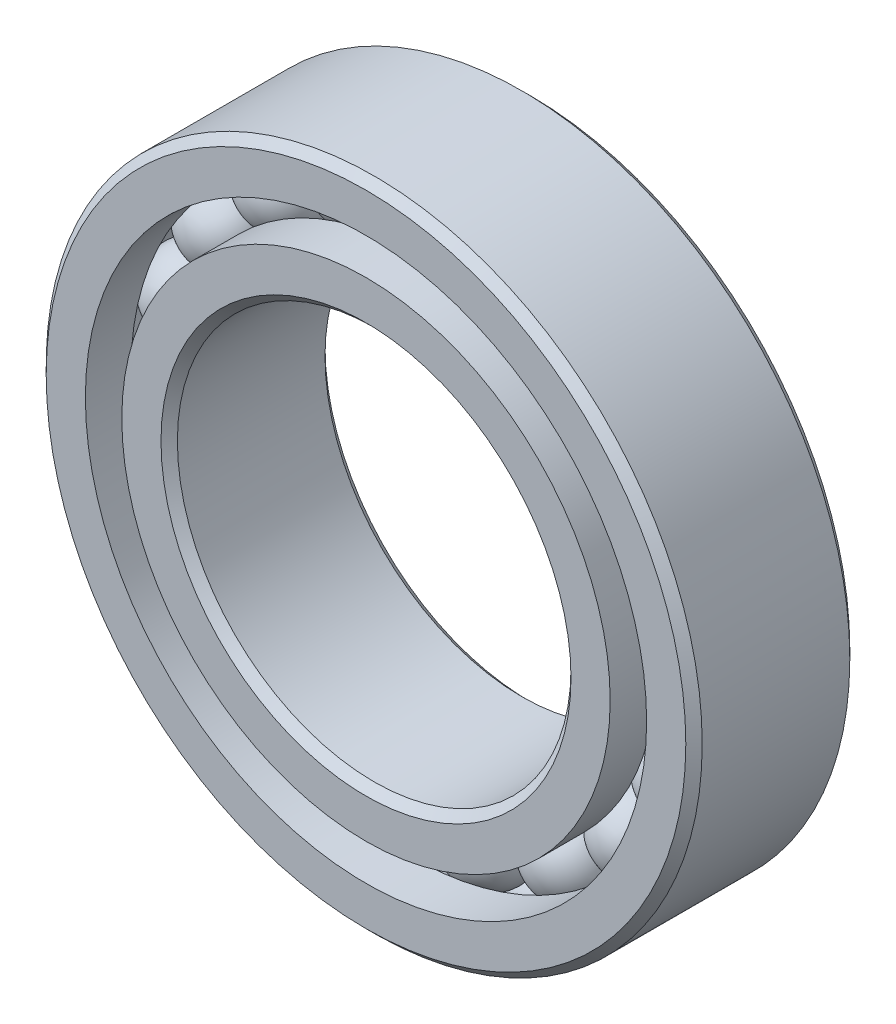
ISO-10303-21;
HEADER;
FILE_DESCRIPTION(('STEP AP214'),'2;1');
FILE_NAME('part.step','',(''),(''),'','','');
FILE_SCHEMA(('AUTOMOTIVE_DESIGN { 1 0 10303 214 1 1 1 1 }'));
ENDSEC;
DATA;
#1=APPLICATION_CONTEXT('core data for automotive mechanical design processes');
#2=APPLICATION_PROTOCOL_DEFINITION('international standard','automotive_design',2000,#1);
#3=PRODUCT_CONTEXT('',#1,'mechanical');
#4=PRODUCT('Part','Part','',(#3));
#5=PRODUCT_RELATED_PRODUCT_CATEGORY('part','',(#4));
#6=PRODUCT_DEFINITION_FORMATION('','',#4);
#7=PRODUCT_DEFINITION_CONTEXT('part definition',#1,'design');
#8=PRODUCT_DEFINITION('design','',#6,#7);
#9=PRODUCT_DEFINITION_SHAPE('','',#8);
#10=(LENGTH_UNIT() NAMED_UNIT(*) SI_UNIT(.MILLI.,.METRE.));
#11=(NAMED_UNIT(*) PLANE_ANGLE_UNIT() SI_UNIT($,.RADIAN.));
#12=(NAMED_UNIT(*) SI_UNIT($,.STERADIAN.) SOLID_ANGLE_UNIT());
#13=UNCERTAINTY_MEASURE_WITH_UNIT(LENGTH_MEASURE(1.E-05),#10,'distance_accuracy_value','');
#14=(GEOMETRIC_REPRESENTATION_CONTEXT(3) GLOBAL_UNCERTAINTY_ASSIGNED_CONTEXT((#13)) GLOBAL_UNIT_ASSIGNED_CONTEXT((#10,
#11,#12)) REPRESENTATION_CONTEXT('',''));
#15=CARTESIAN_POINT('',(0.,0.,0.));
#16=DIRECTION('',(0.,0.,1.));
#17=DIRECTION('',(1.,0.,0.));
#18=AXIS2_PLACEMENT_3D('',#15,#16,#17);
#19=CARTESIAN_POINT('',(-1.29879787681868,3.78326896680256,0.));
#20=DIRECTION('',(0.,0.,1.));
#21=DIRECTION('',(-0.324699469204671,0.945817241700639,0.));
#22=AXIS2_PLACEMENT_3D('',#19,#20,#21);
#23=SPHERICAL_SURFACE('',#22,0.621129993749942);
#24=CARTESIAN_POINT('',(-1.29879787681868,3.78326896680256,0.621129993749942));
#25=VERTEX_POINT('',#24);
#26=VERTEX_LOOP('',#25);
#27=FACE_BOUND('',#26,.T.);
#28=ADVANCED_FACE('F42',(#27),#23,.T.);
#29=CLOSED_SHELL('',(#28));
#30=MANIFOLD_SOLID_BREP('B2',#29);
#31=CARTESIAN_POINT('',(-2.45685085075863,3.1565620375856,0.));
#32=DIRECTION('',(0.,0.,1.));
#33=DIRECTION('',(-0.614212712689658,0.789140509396401,0.));
#34=AXIS2_PLACEMENT_3D('',#31,#32,#33);
#35=SPHERICAL_SURFACE('',#34,0.621129993749942);
#36=CARTESIAN_POINT('',(-2.45685085075863,3.1565620375856,0.621129993749942));
#37=VERTEX_POINT('',#36);
#38=VERTEX_LOOP('',#37);
#39=FACE_BOUND('',#38,.T.);
#40=ADVANCED_FACE('F61',(#39),#35,.T.);
#41=CLOSED_SHELL('',(#40));
#42=MANIFOLD_SOLID_BREP('B6',#41);
#43=CARTESIAN_POINT('',(-3.34866591305009,2.18779263248974,0.));
#44=DIRECTION('',(0.,0.,1.));
#45=DIRECTION('',(-0.837166478262522,0.546948158122436,0.));
#46=AXIS2_PLACEMENT_3D('',#43,#44,#45);
#47=SPHERICAL_SURFACE('',#46,0.621129993749942);
#48=CARTESIAN_POINT('',(-3.34866591305009,2.18779263248974,0.621129993749942));
#49=VERTEX_POINT('',#48);
#50=VERTEX_LOOP('',#49);
#51=FACE_BOUND('',#50,.T.);
#52=ADVANCED_FACE('F80',(#51),#47,.T.);
#53=CLOSED_SHELL('',(#52));
#54=MANIFOLD_SOLID_BREP('B38',#53);
#55=CARTESIAN_POINT('',(-3.87760106375731,0.981941948563236,0.));
#56=DIRECTION('',(0.,0.,1.));
#57=DIRECTION('',(-0.969400265939328,0.245485487140809,0.));
#58=AXIS2_PLACEMENT_3D('',#55,#56,#57);
#59=SPHERICAL_SURFACE('',#58,0.621129993749942);
#60=CARTESIAN_POINT('',(-3.87760106375731,0.981941948563236,0.621129993749942));
#61=VERTEX_POINT('',#60);
#62=VERTEX_LOOP('',#61);
#63=FACE_BOUND('',#62,.T.);
#64=ADVANCED_FACE('F98',(#63),#59,.T.);
#65=CLOSED_SHELL('',(#64));
#66=MANIFOLD_SOLID_BREP('B57',#65);
#67=CARTESIAN_POINT('',(-3.98633797202668,-0.330317381889292,0.));
#68=DIRECTION('',(0.,0.,1.));
#69=DIRECTION('',(-0.996584493006671,-0.082579345472323,0.));
#70=AXIS2_PLACEMENT_3D('',#67,#68,#69);
#71=SPHERICAL_SURFACE('',#70,0.621129993749942);
#72=CARTESIAN_POINT('',(-3.98633797202668,-0.330317381889292,0.621129993749942));
#73=VERTEX_POINT('',#72);
#74=VERTEX_LOOP('',#73);
#75=FACE_BOUND('',#74,.T.);
#76=ADVANCED_FACE('F133',(#75),#71,.T.);
#77=CLOSED_SHELL('',(#76));
#78=MANIFOLD_SOLID_BREP('B76',#77);
#79=CARTESIAN_POINT('',(-3.66309330662024,-1.60678169861184,0.));
#80=DIRECTION('',(0.,0.,1.));
#81=DIRECTION('',(-0.915773326655061,-0.401695424652961,0.));
#82=AXIS2_PLACEMENT_3D('',#79,#80,#81);
#83=SPHERICAL_SURFACE('',#82,0.621129993749942);
#84=CARTESIAN_POINT('',(-3.66309330662024,-1.60678169861184,0.621129993749942));
#85=VERTEX_POINT('',#84);
#86=VERTEX_LOOP('',#85);
#87=FACE_BOUND('',#86,.T.);
#88=ADVANCED_FACE('F168',(#87),#83,.T.);
#89=CLOSED_SHELL('',(#88));
#90=MANIFOLD_SOLID_BREP('B94',#89);
#91=CARTESIAN_POINT('',(-2.94289564269255,-2.70912628650294,0.));
#92=DIRECTION('',(0.,0.,1.));
#93=DIRECTION('',(-0.735723910673137,-0.677281571625735,0.));
#94=AXIS2_PLACEMENT_3D('',#91,#92,#93);
#95=SPHERICAL_SURFACE('',#94,0.621129993749942);
#96=CARTESIAN_POINT('',(-2.94289564269255,-2.70912628650294,0.621129993749942));
#97=VERTEX_POINT('',#96);
#98=VERTEX_LOOP('',#97);
#99=FACE_BOUND('',#98,.T.);
#100=ADVANCED_FACE('F203',(#99),#95,.T.);
#101=CLOSED_SHELL('',(#100));
#102=MANIFOLD_SOLID_BREP('B129',#101);
#103=CARTESIAN_POINT('',(-1.90378957214832,-3.51789500482594,0.));
#104=DIRECTION('',(0.,0.,1.));
#105=DIRECTION('',(-0.47594739303708,-0.879473751206486,0.));
#106=AXIS2_PLACEMENT_3D('',#103,#104,#105);
#107=SPHERICAL_SURFACE('',#106,0.621129993749942);
#108=CARTESIAN_POINT('',(-1.90378957214832,-3.51789500482594,0.621129993749942));
#109=VERTEX_POINT('',#108);
#110=VERTEX_LOOP('',#109);
#111=FACE_BOUND('',#110,.T.);
#112=ADVANCED_FACE('F238',(#111),#107,.T.);
#113=CLOSED_SHELL('',(#112));
#114=MANIFOLD_SOLID_BREP('B164',#113);
#115=CARTESIAN_POINT('',(-0.658378361122963,-3.94544521361088,0.));
#116=DIRECTION('',(0.,0.,1.));
#117=DIRECTION('',(-0.164594590280741,-0.986361303402721,0.));
#118=AXIS2_PLACEMENT_3D('',#115,#116,#117);
#119=SPHERICAL_SURFACE('',#118,0.621129993749942);
#120=CARTESIAN_POINT('',(-0.658378361122963,-3.94544521361088,0.621129993749942));
#121=VERTEX_POINT('',#120);
#122=VERTEX_LOOP('',#121);
#123=FACE_BOUND('',#122,.T.);
#124=ADVANCED_FACE('F273',(#123),#119,.T.);
#125=CLOSED_SHELL('',(#124));
#126=MANIFOLD_SOLID_BREP('B199',#125);
#127=CARTESIAN_POINT('',(0.65837836112291,-3.94544521361089,0.));
#128=DIRECTION('',(0.,0.,1.));
#129=DIRECTION('',(0.164594590280727,-0.986361303402723,0.));
#130=AXIS2_PLACEMENT_3D('',#127,#128,#129);
#131=SPHERICAL_SURFACE('',#130,0.621129993749942);
#132=CARTESIAN_POINT('',(0.65837836112291,-3.94544521361089,0.621129993749942));
#133=VERTEX_POINT('',#132);
#134=VERTEX_LOOP('',#133);
#135=FACE_BOUND('',#134,.T.);
#136=ADVANCED_FACE('F308',(#135),#131,.T.);
#137=CLOSED_SHELL('',(#136));
#138=MANIFOLD_SOLID_BREP('B234',#137);
#139=CARTESIAN_POINT('',(1.90378957214827,-3.51789500482597,0.));
#140=DIRECTION('',(0.,0.,1.));
#141=DIRECTION('',(0.475947393037069,-0.879473751206492,0.));
#142=AXIS2_PLACEMENT_3D('',#139,#140,#141);
#143=SPHERICAL_SURFACE('',#142,0.621129993749942);
#144=CARTESIAN_POINT('',(1.90378957214827,-3.51789500482597,0.621129993749942));
#145=VERTEX_POINT('',#144);
#146=VERTEX_LOOP('',#145);
#147=FACE_BOUND('',#146,.T.);
#148=ADVANCED_FACE('F343',(#147),#143,.T.);
#149=CLOSED_SHELL('',(#148));
#150=MANIFOLD_SOLID_BREP('B269',#149);
#151=CARTESIAN_POINT('',(2.94289564269251,-2.70912628650298,0.));
#152=DIRECTION('',(0.,0.,1.));
#153=DIRECTION('',(0.735723910673128,-0.677281571625745,0.));
#154=AXIS2_PLACEMENT_3D('',#151,#152,#153);
#155=SPHERICAL_SURFACE('',#154,0.621129993749942);
#156=CARTESIAN_POINT('',(2.94289564269251,-2.70912628650298,0.621129993749942));
#157=VERTEX_POINT('',#156);
#158=VERTEX_LOOP('',#157);
#159=FACE_BOUND('',#158,.T.);
#160=ADVANCED_FACE('F378',(#159),#155,.T.);
#161=CLOSED_SHELL('',(#160));
#162=MANIFOLD_SOLID_BREP('B304',#161);
#163=CARTESIAN_POINT('',(3.66309330662022,-1.60678169861189,0.));
#164=DIRECTION('',(0.,0.,1.));
#165=DIRECTION('',(0.915773326655056,-0.401695424652973,0.));
#166=AXIS2_PLACEMENT_3D('',#163,#164,#165);
#167=SPHERICAL_SURFACE('',#166,0.621129993749942);
#168=CARTESIAN_POINT('',(3.66309330662022,-1.60678169861189,0.621129993749942));
#169=VERTEX_POINT('',#168);
#170=VERTEX_LOOP('',#169);
#171=FACE_BOUND('',#170,.T.);
#172=ADVANCED_FACE('F413',(#171),#167,.T.);
#173=CLOSED_SHELL('',(#172));
#174=MANIFOLD_SOLID_BREP('B339',#173);
#175=CARTESIAN_POINT('',(3.98633797202668,-0.330317381889343,0.));
#176=DIRECTION('',(0.,0.,1.));
#177=DIRECTION('',(0.99658449300667,-0.0825793454723358,0.));
#178=AXIS2_PLACEMENT_3D('',#175,#176,#177);
#179=SPHERICAL_SURFACE('',#178,0.621129993749942);
#180=CARTESIAN_POINT('',(3.98633797202668,-0.330317381889343,0.621129993749942));
#181=VERTEX_POINT('',#180);
#182=VERTEX_LOOP('',#181);
#183=FACE_BOUND('',#182,.T.);
#184=ADVANCED_FACE('F448',(#183),#179,.T.);
#185=CLOSED_SHELL('',(#184));
#186=MANIFOLD_SOLID_BREP('B374',#185);
#187=CARTESIAN_POINT('',(3.87760106375732,0.981941948563186,0.));
#188=DIRECTION('',(0.,0.,1.));
#189=DIRECTION('',(0.969400265939331,0.245485487140796,0.));
#190=AXIS2_PLACEMENT_3D('',#187,#188,#189);
#191=SPHERICAL_SURFACE('',#190,0.621129993749942);
#192=CARTESIAN_POINT('',(3.87760106375732,0.981941948563186,0.621129993749942));
#193=VERTEX_POINT('',#192);
#194=VERTEX_LOOP('',#193);
#195=FACE_BOUND('',#194,.T.);
#196=ADVANCED_FACE('F483',(#195),#191,.T.);
#197=CLOSED_SHELL('',(#196));
#198=MANIFOLD_SOLID_BREP('B409',#197);
#199=CARTESIAN_POINT('',(3.34866591305012,2.1877926324897,0.));
#200=DIRECTION('',(0.,0.,1.));
#201=DIRECTION('',(0.83716647826253,0.546948158122425,0.));
#202=AXIS2_PLACEMENT_3D('',#199,#200,#201);
#203=SPHERICAL_SURFACE('',#202,0.621129993749942);
#204=CARTESIAN_POINT('',(3.34866591305012,2.1877926324897,0.621129993749942));
#205=VERTEX_POINT('',#204);
#206=VERTEX_LOOP('',#205);
#207=FACE_BOUND('',#206,.T.);
#208=ADVANCED_FACE('F518',(#207),#203,.T.);
#209=CLOSED_SHELL('',(#208));
#210=MANIFOLD_SOLID_BREP('B444',#209);
#211=CARTESIAN_POINT('',(2.45685085075868,3.15656203758557,0.));
#212=DIRECTION('',(0.,0.,1.));
#213=DIRECTION('',(0.614212712689669,0.789140509396393,0.));
#214=AXIS2_PLACEMENT_3D('',#211,#212,#213);
#215=SPHERICAL_SURFACE('',#214,0.621129993749942);
#216=CARTESIAN_POINT('',(2.45685085075868,3.15656203758557,0.621129993749942));
#217=VERTEX_POINT('',#216);
#218=VERTEX_LOOP('',#217);
#219=FACE_BOUND('',#218,.T.);
#220=ADVANCED_FACE('F553',(#219),#215,.T.);
#221=CLOSED_SHELL('',(#220));
#222=MANIFOLD_SOLID_BREP('B479',#221);
#223=CARTESIAN_POINT('',(1.29879787681874,3.78326896680254,0.));
#224=DIRECTION('',(0.,0.,1.));
#225=DIRECTION('',(0.324699469204684,0.945817241700635,0.));
#226=AXIS2_PLACEMENT_3D('',#223,#224,#225);
#227=SPHERICAL_SURFACE('',#226,0.621129993749942);
#228=CARTESIAN_POINT('',(1.29879787681874,3.78326896680254,0.621129993749942));
#229=VERTEX_POINT('',#228);
#230=VERTEX_LOOP('',#229);
#231=FACE_BOUND('',#230,.T.);
#232=ADVANCED_FACE('F588',(#231),#227,.T.);
#233=CLOSED_SHELL('',(#232));
#234=MANIFOLD_SOLID_BREP('B514',#233);
#235=CARTESIAN_POINT('',(0.,4.,0.));
#236=DIRECTION('',(0.,0.,1.));
#237=DIRECTION('',(0.,1.,0.));
#238=AXIS2_PLACEMENT_3D('',#235,#236,#237);
#239=SPHERICAL_SURFACE('',#238,0.621129993749942);
#240=CARTESIAN_POINT('',(0.,4.,0.621129993749942));
#241=VERTEX_POINT('',#240);
#242=VERTEX_LOOP('',#241);
#243=FACE_BOUND('',#242,.T.);
#244=ADVANCED_FACE('F625',(#243),#239,.T.);
#245=CLOSED_SHELL('',(#244));
#246=MANIFOLD_SOLID_BREP('B549',#245);
#247=CARTESIAN_POINT('',(0.,3.72222222222222,1.25));
#248=DIRECTION('',(0.,0.,-1.));
#249=DIRECTION('',(-1.,0.,0.));
#250=AXIS2_PLACEMENT_3D('',#247,#248,#249);
#251=PLANE('',#250);
#252=CARTESIAN_POINT('',(0.,0.,1.25));
#253=DIRECTION('',(0.,0.,1.));
#254=DIRECTION('',(1.,0.,0.));
#255=AXIS2_PLACEMENT_3D('',#252,#253,#254);
#256=CIRCLE('',#255,3.125);
#257=CARTESIAN_POINT('',(3.125,0.,1.25));
#258=VERTEX_POINT('',#257);
#259=EDGE_CURVE('E624',#258,#258,#256,.T.);
#260=ORIENTED_EDGE('',*,*,#259,.F.);
#261=EDGE_LOOP('',(#260));
#262=FACE_BOUND('',#261,.T.);
#263=CARTESIAN_POINT('',(0.,0.,1.25));
#264=DIRECTION('',(0.,0.,1.));
#265=DIRECTION('',(1.,0.,0.));
#266=AXIS2_PLACEMENT_3D('',#263,#264,#265);
#267=CIRCLE('',#266,3.72222222222222);
#268=CARTESIAN_POINT('',(3.72222222222222,0.,1.25));
#269=VERTEX_POINT('',#268);
#270=EDGE_CURVE('E672',#269,#269,#267,.T.);
#271=ORIENTED_EDGE('',*,*,#270,.T.);
#272=EDGE_LOOP('',(#271));
#273=FACE_BOUND('',#272,.T.);
#274=ADVANCED_FACE('F644',(#262,#273),#251,.F.);
#275=CARTESIAN_POINT('',(0.,0.,1.25));
#276=DIRECTION('',(0.,0.,1.));
#277=DIRECTION('',(1.,0.,0.));
#278=AXIS2_PLACEMENT_3D('',#275,#276,#277);
#279=CONICAL_SURFACE('',#278,3.125,0.78539816339745);
#280=CARTESIAN_POINT('',(0.,0.,1.125));
#281=DIRECTION('',(0.,0.,1.));
#282=DIRECTION('',(1.,0.,0.));
#283=AXIS2_PLACEMENT_3D('',#280,#281,#282);
#284=CIRCLE('',#283,3.);
#285=CARTESIAN_POINT('',(3.,0.,1.125));
#286=VERTEX_POINT('',#285);
#287=EDGE_CURVE('E650',#286,#286,#284,.T.);
#288=ORIENTED_EDGE('',*,*,#287,.F.);
#289=EDGE_LOOP('',(#288));
#290=FACE_BOUND('',#289,.T.);
#291=ORIENTED_EDGE('',*,*,#259,.T.);
#292=EDGE_LOOP('',(#291));
#293=FACE_BOUND('',#292,.T.);
#294=ADVANCED_FACE('F709',(#290,#293),#279,.F.);
#295=CARTESIAN_POINT('',(0.,0.,1.25));
#296=DIRECTION('',(0.,0.,1.));
#297=DIRECTION('',(1.,0.,0.));
#298=AXIS2_PLACEMENT_3D('',#295,#296,#297);
#299=CYLINDRICAL_SURFACE('',#298,3.);
#300=CARTESIAN_POINT('',(0.,0.,-1.125));
#301=DIRECTION('',(0.,0.,1.));
#302=DIRECTION('',(1.,0.,0.));
#303=AXIS2_PLACEMENT_3D('',#300,#301,#302);
#304=CIRCLE('',#303,3.);
#305=CARTESIAN_POINT('',(3.,0.,-1.125));
#306=VERTEX_POINT('',#305);
#307=EDGE_CURVE('E654',#306,#306,#304,.T.);
#308=ORIENTED_EDGE('',*,*,#307,.F.);
#309=EDGE_LOOP('',(#308));
#310=FACE_BOUND('',#309,.T.);
#311=ORIENTED_EDGE('',*,*,#287,.T.);
#312=EDGE_LOOP('',(#311));
#313=FACE_BOUND('',#312,.T.);
#314=ADVANCED_FACE('F704',(#310,#313),#299,.F.);
#315=CARTESIAN_POINT('',(0.,0.,-1.125));
#316=DIRECTION('',(0.,0.,-1.));
#317=DIRECTION('',(-1.,0.,0.));
#318=AXIS2_PLACEMENT_3D('',#315,#316,#317);
#319=CONICAL_SURFACE('',#318,3.,0.78539816339745);
#320=CARTESIAN_POINT('',(0.,0.,-1.25));
#321=DIRECTION('',(0.,0.,1.));
#322=DIRECTION('',(1.,0.,0.));
#323=AXIS2_PLACEMENT_3D('',#320,#321,#322);
#324=CIRCLE('',#323,3.125);
#325=CARTESIAN_POINT('',(3.125,0.,-1.25));
#326=VERTEX_POINT('',#325);
#327=EDGE_CURVE('E658',#326,#326,#324,.T.);
#328=ORIENTED_EDGE('',*,*,#327,.F.);
#329=EDGE_LOOP('',(#328));
#330=FACE_BOUND('',#329,.T.);
#331=ORIENTED_EDGE('',*,*,#307,.T.);
#332=EDGE_LOOP('',(#331));
#333=FACE_BOUND('',#332,.T.);
#334=ADVANCED_FACE('F698',(#330,#333),#319,.F.);
#335=CARTESIAN_POINT('',(0.,3.72222222222222,-1.25));
#336=DIRECTION('',(0.,0.,1.));
#337=DIRECTION('',(1.,0.,0.));
#338=AXIS2_PLACEMENT_3D('',#335,#336,#337);
#339=PLANE('',#338);
#340=CARTESIAN_POINT('',(0.,0.,-1.25));
#341=DIRECTION('',(0.,0.,1.));
#342=DIRECTION('',(1.,0.,0.));
#343=AXIS2_PLACEMENT_3D('',#340,#341,#342);
#344=CIRCLE('',#343,3.72222222222222);
#345=CARTESIAN_POINT('',(3.72222222222222,0.,-1.25));
#346=VERTEX_POINT('',#345);
#347=EDGE_CURVE('E663',#346,#346,#344,.T.);
#348=ORIENTED_EDGE('',*,*,#347,.F.);
#349=EDGE_LOOP('',(#348));
#350=FACE_BOUND('',#349,.T.);
#351=ORIENTED_EDGE('',*,*,#327,.T.);
#352=EDGE_LOOP('',(#351));
#353=FACE_BOUND('',#352,.T.);
#354=ADVANCED_FACE('F692',(#350,#353),#339,.F.);
#355=CARTESIAN_POINT('',(0.,0.,1.25));
#356=DIRECTION('',(0.,0.,1.));
#357=DIRECTION('',(1.,0.,0.));
#358=AXIS2_PLACEMENT_3D('',#355,#356,#357);
#359=CYLINDRICAL_SURFACE('',#358,3.72222222222222);
#360=CARTESIAN_POINT('',(0.,0.,-0.555555555555555));
#361=DIRECTION('',(0.,0.,1.));
#362=DIRECTION('',(1.,0.,0.));
#363=AXIS2_PLACEMENT_3D('',#360,#361,#362);
#364=CIRCLE('',#363,3.72222222222222);
#365=CARTESIAN_POINT('',(3.72222222222222,0.,-0.555555555555555));
#366=VERTEX_POINT('',#365);
#367=EDGE_CURVE('E666',#366,#366,#364,.T.);
#368=ORIENTED_EDGE('',*,*,#367,.F.);
#369=EDGE_LOOP('',(#368));
#370=FACE_BOUND('',#369,.T.);
#371=ORIENTED_EDGE('',*,*,#347,.T.);
#372=EDGE_LOOP('',(#371));
#373=FACE_BOUND('',#372,.T.);
#374=ADVANCED_FACE('F686',(#370,#373),#359,.T.);
#375=CARTESIAN_POINT('',(0.,0.,0.));
#376=DIRECTION('',(0.,0.,1.));
#377=DIRECTION('',(1.,0.,0.));
#378=AXIS2_PLACEMENT_3D('',#375,#376,#377);
#379=TOROIDAL_SURFACE('',#378,4.,0.621129993749941);
#380=CARTESIAN_POINT('',(0.,0.,0.555555555555556));
#381=DIRECTION('',(0.,0.,1.));
#382=DIRECTION('',(1.,0.,0.));
#383=AXIS2_PLACEMENT_3D('',#380,#381,#382);
#384=CIRCLE('',#383,3.72222222222222);
#385=CARTESIAN_POINT('',(3.72222222222222,0.,0.555555555555556));
#386=VERTEX_POINT('',#385);
#387=EDGE_CURVE('E669',#386,#386,#384,.T.);
#388=ORIENTED_EDGE('',*,*,#387,.F.);
#389=EDGE_LOOP('',(#388));
#390=FACE_BOUND('',#389,.T.);
#391=ORIENTED_EDGE('',*,*,#367,.T.);
#392=EDGE_LOOP('',(#391));
#393=FACE_BOUND('',#392,.T.);
#394=ADVANCED_FACE('F680',(#390,#393),#379,.F.);
#395=CARTESIAN_POINT('',(0.,0.,1.25));
#396=DIRECTION('',(0.,0.,1.));
#397=DIRECTION('',(1.,0.,0.));
#398=AXIS2_PLACEMENT_3D('',#395,#396,#397);
#399=CYLINDRICAL_SURFACE('',#398,3.72222222222222);
#400=ORIENTED_EDGE('',*,*,#270,.F.);
#401=EDGE_LOOP('',(#400));
#402=FACE_BOUND('',#401,.T.);
#403=ORIENTED_EDGE('',*,*,#387,.T.);
#404=EDGE_LOOP('',(#403));
#405=FACE_BOUND('',#404,.T.);
#406=ADVANCED_FACE('F677',(#402,#405),#399,.T.);
#407=CLOSED_SHELL('',(#274,#294,#314,#334,#354,#374,#394,#406));
#408=MANIFOLD_SOLID_BREP('B584',#407);
#409=CARTESIAN_POINT('',(0.,0.,1.125));
#410=DIRECTION('',(0.,0.,-1.));
#411=DIRECTION('',(-1.,0.,0.));
#412=AXIS2_PLACEMENT_3D('',#409,#410,#411);
#413=CONICAL_SURFACE('',#412,5.,0.785398163397446);
#414=CARTESIAN_POINT('',(0.,0.,1.25));
#415=DIRECTION('',(0.,0.,1.));
#416=DIRECTION('',(1.,0.,0.));
#417=AXIS2_PLACEMENT_3D('',#414,#415,#416);
#418=CIRCLE('',#417,4.875);
#419=CARTESIAN_POINT('',(4.875,0.,1.25));
#420=VERTEX_POINT('',#419);
#421=EDGE_CURVE('E793',#420,#420,#418,.T.);
#422=ORIENTED_EDGE('',*,*,#421,.F.);
#423=EDGE_LOOP('',(#422));
#424=FACE_BOUND('',#423,.T.);
#425=CARTESIAN_POINT('',(0.,0.,1.125));
#426=DIRECTION('',(0.,0.,1.));
#427=DIRECTION('',(1.,0.,0.));
#428=AXIS2_PLACEMENT_3D('',#425,#426,#427);
#429=CIRCLE('',#428,5.);
#430=CARTESIAN_POINT('',(5.,0.,1.125));
#431=VERTEX_POINT('',#430);
#432=EDGE_CURVE('E643',#431,#431,#429,.T.);
#433=ORIENTED_EDGE('',*,*,#432,.T.);
#434=EDGE_LOOP('',(#433));
#435=FACE_BOUND('',#434,.T.);
#436=ADVANCED_FACE('F765',(#424,#435),#413,.T.);
#437=CARTESIAN_POINT('',(0.,0.,1.25));
#438=DIRECTION('',(0.,0.,1.));
#439=DIRECTION('',(1.,0.,0.));
#440=AXIS2_PLACEMENT_3D('',#437,#438,#439);
#441=CYLINDRICAL_SURFACE('',#440,5.);
#442=ORIENTED_EDGE('',*,*,#432,.F.);
#443=EDGE_LOOP('',(#442));
#444=FACE_BOUND('',#443,.T.);
#445=CARTESIAN_POINT('',(0.,0.,-1.125));
#446=DIRECTION('',(0.,0.,1.));
#447=DIRECTION('',(1.,0.,0.));
#448=AXIS2_PLACEMENT_3D('',#445,#446,#447);
#449=CIRCLE('',#448,5.);
#450=CARTESIAN_POINT('',(5.,0.,-1.125));
#451=VERTEX_POINT('',#450);
#452=EDGE_CURVE('E771',#451,#451,#449,.T.);
#453=ORIENTED_EDGE('',*,*,#452,.T.);
#454=EDGE_LOOP('',(#453));
#455=FACE_BOUND('',#454,.T.);
#456=ADVANCED_FACE('F800',(#444,#455),#441,.T.);
#457=CARTESIAN_POINT('',(0.,0.,-1.25));
#458=DIRECTION('',(0.,0.,1.));
#459=DIRECTION('',(1.,0.,0.));
#460=AXIS2_PLACEMENT_3D('',#457,#458,#459);
#461=CONICAL_SURFACE('',#460,4.875,0.785398163397445);
#462=ORIENTED_EDGE('',*,*,#452,.F.);
#463=EDGE_LOOP('',(#462));
#464=FACE_BOUND('',#463,.T.);
#465=CARTESIAN_POINT('',(0.,0.,-1.25));
#466=DIRECTION('',(0.,0.,1.));
#467=DIRECTION('',(1.,0.,0.));
#468=AXIS2_PLACEMENT_3D('',#465,#466,#467);
#469=CIRCLE('',#468,4.875);
#470=CARTESIAN_POINT('',(4.875,0.,-1.25));
#471=VERTEX_POINT('',#470);
#472=EDGE_CURVE('E775',#471,#471,#469,.T.);
#473=ORIENTED_EDGE('',*,*,#472,.T.);
#474=EDGE_LOOP('',(#473));
#475=FACE_BOUND('',#474,.T.);
#476=ADVANCED_FACE('F804',(#464,#475),#461,.T.);
#477=CARTESIAN_POINT('',(0.,4.875,-1.25));
#478=DIRECTION('',(0.,0.,1.));
#479=DIRECTION('',(1.,0.,0.));
#480=AXIS2_PLACEMENT_3D('',#477,#478,#479);
#481=PLANE('',#480);
#482=ORIENTED_EDGE('',*,*,#472,.F.);
#483=EDGE_LOOP('',(#482));
#484=FACE_BOUND('',#483,.T.);
#485=CARTESIAN_POINT('',(0.,0.,-1.25));
#486=DIRECTION('',(0.,0.,1.));
#487=DIRECTION('',(1.,0.,0.));
#488=AXIS2_PLACEMENT_3D('',#485,#486,#487);
#489=CIRCLE('',#488,4.27777777777778);
#490=CARTESIAN_POINT('',(4.27777777777778,0.,-1.25));
#491=VERTEX_POINT('',#490);
#492=EDGE_CURVE('E779',#491,#491,#489,.T.);
#493=ORIENTED_EDGE('',*,*,#492,.T.);
#494=EDGE_LOOP('',(#493));
#495=FACE_BOUND('',#494,.T.);
#496=ADVANCED_FACE('F809',(#484,#495),#481,.F.);
#497=CARTESIAN_POINT('',(0.,0.,1.25));
#498=DIRECTION('',(0.,0.,1.));
#499=DIRECTION('',(1.,0.,0.));
#500=AXIS2_PLACEMENT_3D('',#497,#498,#499);
#501=CYLINDRICAL_SURFACE('',#500,4.27777777777778);
#502=ORIENTED_EDGE('',*,*,#492,.F.);
#503=EDGE_LOOP('',(#502));
#504=FACE_BOUND('',#503,.T.);
#505=CARTESIAN_POINT('',(0.,0.,-0.555555555555555));
#506=DIRECTION('',(0.,0.,1.));
#507=DIRECTION('',(1.,0.,0.));
#508=AXIS2_PLACEMENT_3D('',#505,#506,#507);
#509=CIRCLE('',#508,4.27777777777778);
#510=CARTESIAN_POINT('',(4.27777777777778,0.,-0.555555555555555));
#511=VERTEX_POINT('',#510);
#512=EDGE_CURVE('E784',#511,#511,#509,.T.);
#513=ORIENTED_EDGE('',*,*,#512,.T.);
#514=EDGE_LOOP('',(#513));
#515=FACE_BOUND('',#514,.T.);
#516=ADVANCED_FACE('F815',(#504,#515),#501,.F.);
#517=CARTESIAN_POINT('',(0.,0.,0.));
#518=DIRECTION('',(0.,0.,1.));
#519=DIRECTION('',(1.,0.,0.));
#520=AXIS2_PLACEMENT_3D('',#517,#518,#519);
#521=TOROIDAL_SURFACE('',#520,4.,0.621129993749942);
#522=ORIENTED_EDGE('',*,*,#512,.F.);
#523=EDGE_LOOP('',(#522));
#524=FACE_BOUND('',#523,.T.);
#525=CARTESIAN_POINT('',(0.,0.,0.555555555555556));
#526=DIRECTION('',(0.,0.,1.));
#527=DIRECTION('',(1.,0.,0.));
#528=AXIS2_PLACEMENT_3D('',#525,#526,#527);
#529=CIRCLE('',#528,4.27777777777778);
#530=CARTESIAN_POINT('',(4.27777777777778,0.,0.555555555555556));
#531=VERTEX_POINT('',#530);
#532=EDGE_CURVE('E787',#531,#531,#529,.T.);
#533=ORIENTED_EDGE('',*,*,#532,.T.);
#534=EDGE_LOOP('',(#533));
#535=FACE_BOUND('',#534,.T.);
#536=ADVANCED_FACE('F819',(#524,#535),#521,.F.);
#537=CARTESIAN_POINT('',(0.,0.,1.25));
#538=DIRECTION('',(0.,0.,1.));
#539=DIRECTION('',(1.,0.,0.));
#540=AXIS2_PLACEMENT_3D('',#537,#538,#539);
#541=CYLINDRICAL_SURFACE('',#540,4.27777777777778);
#542=ORIENTED_EDGE('',*,*,#532,.F.);
#543=EDGE_LOOP('',(#542));
#544=FACE_BOUND('',#543,.T.);
#545=CARTESIAN_POINT('',(0.,0.,1.25));
#546=DIRECTION('',(0.,0.,1.));
#547=DIRECTION('',(1.,0.,0.));
#548=AXIS2_PLACEMENT_3D('',#545,#546,#547);
#549=CIRCLE('',#548,4.27777777777778);
#550=CARTESIAN_POINT('',(4.27777777777778,0.,1.25));
#551=VERTEX_POINT('',#550);
#552=EDGE_CURVE('E790',#551,#551,#549,.T.);
#553=ORIENTED_EDGE('',*,*,#552,.T.);
#554=EDGE_LOOP('',(#553));
#555=FACE_BOUND('',#554,.T.);
#556=ADVANCED_FACE('F823',(#544,#555),#541,.F.);
#557=CARTESIAN_POINT('',(0.,4.875,1.25));
#558=DIRECTION('',(0.,0.,-1.));
#559=DIRECTION('',(-1.,0.,0.));
#560=AXIS2_PLACEMENT_3D('',#557,#558,#559);
#561=PLANE('',#560);
#562=ORIENTED_EDGE('',*,*,#552,.F.);
#563=EDGE_LOOP('',(#562));
#564=FACE_BOUND('',#563,.T.);
#565=ORIENTED_EDGE('',*,*,#421,.T.);
#566=EDGE_LOOP('',(#565));
#567=FACE_BOUND('',#566,.T.);
#568=ADVANCED_FACE('F797',(#564,#567),#561,.F.);
#569=CLOSED_SHELL('',(#436,#456,#476,#496,#516,#536,#556,#568));
#570=MANIFOLD_SOLID_BREP('B619',#569);
#571=ADVANCED_BREP_SHAPE_REPRESENTATION('',(#18,#30,#42,#54,#66,#78,#90,#102,#114,#126,#138,
#150,#162,#174,#186,#198,#210,#222,#234,#246,#408,#570),#14);
#572=SHAPE_DEFINITION_REPRESENTATION(#9,#571);
ENDSEC;
END-ISO-10303-21;
